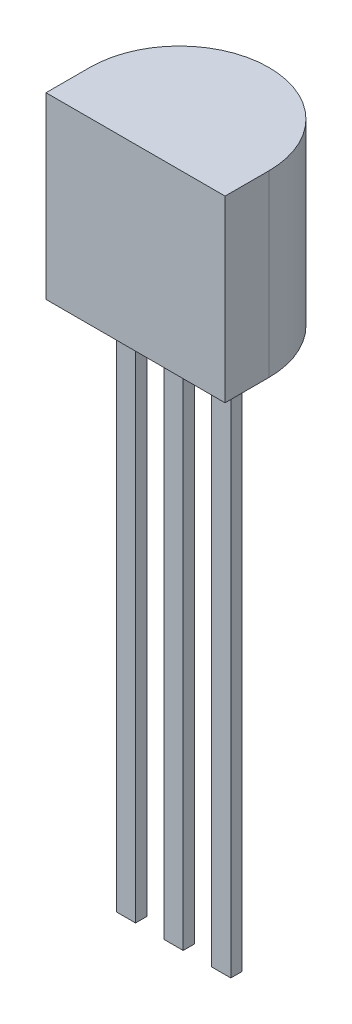
ISO-10303-21;
HEADER;
FILE_DESCRIPTION(('STEP AP214'),'2;1');
FILE_NAME('part.step','',(''),(''),'','','');
FILE_SCHEMA(('AUTOMOTIVE_DESIGN { 1 0 10303 214 1 1 1 1 }'));
ENDSEC;
DATA;
#1=APPLICATION_CONTEXT('core data for automotive mechanical design processes');
#2=APPLICATION_PROTOCOL_DEFINITION('international standard','automotive_design',2000,#1);
#3=PRODUCT_CONTEXT('',#1,'mechanical');
#4=PRODUCT('Part','Part','',(#3));
#5=PRODUCT_RELATED_PRODUCT_CATEGORY('part','',(#4));
#6=PRODUCT_DEFINITION_FORMATION('','',#4);
#7=PRODUCT_DEFINITION_CONTEXT('part definition',#1,'design');
#8=PRODUCT_DEFINITION('design','',#6,#7);
#9=PRODUCT_DEFINITION_SHAPE('','',#8);
#10=(LENGTH_UNIT() NAMED_UNIT(*) SI_UNIT(.MILLI.,.METRE.));
#11=(NAMED_UNIT(*) PLANE_ANGLE_UNIT() SI_UNIT($,.RADIAN.));
#12=(NAMED_UNIT(*) SI_UNIT($,.STERADIAN.) SOLID_ANGLE_UNIT());
#13=UNCERTAINTY_MEASURE_WITH_UNIT(LENGTH_MEASURE(1.E-05),#10,'distance_accuracy_value','');
#14=(GEOMETRIC_REPRESENTATION_CONTEXT(3) GLOBAL_UNCERTAINTY_ASSIGNED_CONTEXT((#13)) GLOBAL_UNIT_ASSIGNED_CONTEXT((#10,
#11,#12)) REPRESENTATION_CONTEXT('',''));
#15=CARTESIAN_POINT('',(0.,0.,0.));
#16=DIRECTION('',(0.,0.,1.));
#17=DIRECTION('',(1.,0.,0.));
#18=AXIS2_PLACEMENT_3D('',#15,#16,#17);
#19=CARTESIAN_POINT('',(0.,0.,-1.15));
#20=DIRECTION('',(0.,1.,0.));
#21=DIRECTION('',(0.,0.,1.));
#22=AXIS2_PLACEMENT_3D('',#19,#20,#21);
#23=PLANE('',#22);
#24=DIRECTION('',(-1.,0.,0.));
#25=VECTOR('',#24,1.);
#26=CARTESIAN_POINT('',(-0.999999999999999,0.,-1.));
#27=LINE('',#26,#25);
#28=CARTESIAN_POINT('',(-0.999999999999999,0.,-1.));
#29=VERTEX_POINT('',#28);
#30=CARTESIAN_POINT('',(-1.5,0.,-1.));
#31=VERTEX_POINT('',#30);
#32=EDGE_CURVE('E169',#29,#31,#27,.T.);
#33=ORIENTED_EDGE('',*,*,#32,.F.);
#34=DIRECTION('',(0.,0.,1.));
#35=VECTOR('',#34,1.);
#36=CARTESIAN_POINT('',(-0.999999999999999,0.,-1.));
#37=LINE('',#36,#35);
#38=CARTESIAN_POINT('',(-0.999999999999999,0.,-1.3));
#39=VERTEX_POINT('',#38);
#40=EDGE_CURVE('E182',#39,#29,#37,.T.);
#41=ORIENTED_EDGE('',*,*,#40,.F.);
#42=DIRECTION('',(1.,0.,0.));
#43=VECTOR('',#42,1.);
#44=CARTESIAN_POINT('',(-0.999999999999999,0.,-1.3));
#45=LINE('',#44,#43);
#46=CARTESIAN_POINT('',(-1.5,0.,-1.3));
#47=VERTEX_POINT('',#46);
#48=EDGE_CURVE('E191',#47,#39,#45,.T.);
#49=ORIENTED_EDGE('',*,*,#48,.F.);
#50=DIRECTION('',(0.,0.,-1.));
#51=VECTOR('',#50,1.);
#52=CARTESIAN_POINT('',(-1.5,0.,-1.));
#53=LINE('',#52,#51);
#54=EDGE_CURVE('E172',#31,#47,#53,.T.);
#55=ORIENTED_EDGE('',*,*,#54,.F.);
#56=EDGE_LOOP('',(#33,#41,#49,#55));
#57=FACE_BOUND('',#56,.T.);
#58=DIRECTION('',(0.,0.,1.));
#59=VECTOR('',#58,1.);
#60=CARTESIAN_POINT('',(-2.35,0.,0.));
#61=LINE('',#60,#59);
#62=CARTESIAN_POINT('',(-2.35,0.,-1.15));
#63=VERTEX_POINT('',#62);
#64=CARTESIAN_POINT('',(-2.35,0.,0.));
#65=VERTEX_POINT('',#64);
#66=EDGE_CURVE('E240',#63,#65,#61,.T.);
#67=ORIENTED_EDGE('',*,*,#66,.F.);
#68=CARTESIAN_POINT('',(0.,0.,-1.15));
#69=DIRECTION('',(0.,1.,0.));
#70=DIRECTION('',(0.,0.,1.));
#71=AXIS2_PLACEMENT_3D('',#68,#69,#70);
#72=CIRCLE('',#71,2.35);
#73=CARTESIAN_POINT('',(2.35,0.,-1.15));
#74=VERTEX_POINT('',#73);
#75=EDGE_CURVE('E245',#74,#63,#72,.T.);
#76=ORIENTED_EDGE('',*,*,#75,.F.);
#77=DIRECTION('',(0.,0.,-1.));
#78=VECTOR('',#77,1.);
#79=CARTESIAN_POINT('',(2.35,0.,0.));
#80=LINE('',#79,#78);
#81=CARTESIAN_POINT('',(2.35,0.,0.));
#82=VERTEX_POINT('',#81);
#83=EDGE_CURVE('E256',#82,#74,#80,.T.);
#84=ORIENTED_EDGE('',*,*,#83,.F.);
#85=DIRECTION('',(1.,0.,0.));
#86=VECTOR('',#85,1.);
#87=CARTESIAN_POINT('',(-2.35,0.,0.));
#88=LINE('',#87,#86);
#89=EDGE_CURVE('E254',#65,#82,#88,.T.);
#90=ORIENTED_EDGE('',*,*,#89,.F.);
#91=EDGE_LOOP('',(#67,#76,#84,#90));
#92=FACE_BOUND('',#91,.T.);
#93=DIRECTION('',(0.,0.,-1.));
#94=VECTOR('',#93,1.);
#95=CARTESIAN_POINT('',(-0.25,0.,-1.));
#96=LINE('',#95,#94);
#97=CARTESIAN_POINT('',(-0.25,0.,-1.));
#98=VERTEX_POINT('',#97);
#99=CARTESIAN_POINT('',(-0.25,0.,-1.3));
#100=VERTEX_POINT('',#99);
#101=EDGE_CURVE('E207',#98,#100,#96,.T.);
#102=ORIENTED_EDGE('',*,*,#101,.F.);
#103=DIRECTION('',(-1.,0.,0.));
#104=VECTOR('',#103,1.);
#105=CARTESIAN_POINT('',(-0.25,0.,-1.));
#106=LINE('',#105,#104);
#107=CARTESIAN_POINT('',(0.25,0.,-1.));
#108=VERTEX_POINT('',#107);
#109=EDGE_CURVE('E212',#108,#98,#106,.T.);
#110=ORIENTED_EDGE('',*,*,#109,.F.);
#111=DIRECTION('',(0.,0.,1.));
#112=VECTOR('',#111,1.);
#113=CARTESIAN_POINT('',(0.25,0.,-1.));
#114=LINE('',#113,#112);
#115=CARTESIAN_POINT('',(0.250000000000001,0.,-1.3));
#116=VERTEX_POINT('',#115);
#117=EDGE_CURVE('E224',#116,#108,#114,.T.);
#118=ORIENTED_EDGE('',*,*,#117,.F.);
#119=DIRECTION('',(1.,0.,0.));
#120=VECTOR('',#119,1.);
#121=CARTESIAN_POINT('',(-0.25,0.,-1.3));
#122=LINE('',#121,#120);
#123=EDGE_CURVE('E221',#100,#116,#122,.T.);
#124=ORIENTED_EDGE('',*,*,#123,.F.);
#125=EDGE_LOOP('',(#102,#110,#118,#124));
#126=FACE_BOUND('',#125,.T.);
#127=DIRECTION('',(0.,0.,-1.));
#128=VECTOR('',#127,1.);
#129=CARTESIAN_POINT('',(1.,0.,-1.));
#130=LINE('',#129,#128);
#131=CARTESIAN_POINT('',(1.,0.,-1.));
#132=VERTEX_POINT('',#131);
#133=CARTESIAN_POINT('',(1.,0.,-1.3));
#134=VERTEX_POINT('',#133);
#135=EDGE_CURVE('E168',#132,#134,#130,.T.);
#136=ORIENTED_EDGE('',*,*,#135,.F.);
#137=DIRECTION('',(-1.,0.,0.));
#138=VECTOR('',#137,1.);
#139=CARTESIAN_POINT('',(1.,0.,-1.));
#140=LINE('',#139,#138);
#141=CARTESIAN_POINT('',(1.5,0.,-1.));
#142=VERTEX_POINT('',#141);
#143=EDGE_CURVE('E165',#142,#132,#140,.T.);
#144=ORIENTED_EDGE('',*,*,#143,.F.);
#145=DIRECTION('',(0.,0.,1.));
#146=VECTOR('',#145,1.);
#147=CARTESIAN_POINT('',(1.5,0.,-1.));
#148=LINE('',#147,#146);
#149=CARTESIAN_POINT('',(1.5,0.,-1.3));
#150=VERTEX_POINT('',#149);
#151=EDGE_CURVE('E55',#150,#142,#148,.T.);
#152=ORIENTED_EDGE('',*,*,#151,.F.);
#153=DIRECTION('',(1.,0.,0.));
#154=VECTOR('',#153,1.);
#155=CARTESIAN_POINT('',(1.,0.,-1.3));
#156=LINE('',#155,#154);
#157=EDGE_CURVE('E50',#134,#150,#156,.T.);
#158=ORIENTED_EDGE('',*,*,#157,.F.);
#159=EDGE_LOOP('',(#136,#144,#152,#158));
#160=FACE_BOUND('',#159,.T.);
#161=ADVANCED_FACE('F35',(#57,#92,#126,#160),#23,.F.);
#162=CARTESIAN_POINT('',(-2.35,4.7,0.));
#163=DIRECTION('',(1.,0.,0.));
#164=DIRECTION('',(0.,0.,-1.));
#165=AXIS2_PLACEMENT_3D('',#162,#163,#164);
#166=PLANE('',#165);
#167=ORIENTED_EDGE('',*,*,#66,.T.);
#168=DIRECTION('',(0.,-1.,0.));
#169=VECTOR('',#168,1.);
#170=CARTESIAN_POINT('',(-2.35,4.7,0.));
#171=LINE('',#170,#169);
#172=CARTESIAN_POINT('',(-2.35,4.7,0.));
#173=VERTEX_POINT('',#172);
#174=EDGE_CURVE('E11',#173,#65,#171,.T.);
#175=ORIENTED_EDGE('',*,*,#174,.F.);
#176=DIRECTION('',(0.,0.,1.));
#177=VECTOR('',#176,1.);
#178=CARTESIAN_POINT('',(-2.35,4.7,0.));
#179=LINE('',#178,#177);
#180=CARTESIAN_POINT('',(-2.35,4.7,-1.15));
#181=VERTEX_POINT('',#180);
#182=EDGE_CURVE('E241',#181,#173,#179,.T.);
#183=ORIENTED_EDGE('',*,*,#182,.F.);
#184=DIRECTION('',(0.,-1.,0.));
#185=VECTOR('',#184,1.);
#186=CARTESIAN_POINT('',(-2.35,4.7,-1.15));
#187=LINE('',#186,#185);
#188=EDGE_CURVE('E251',#181,#63,#187,.T.);
#189=ORIENTED_EDGE('',*,*,#188,.T.);
#190=EDGE_LOOP('',(#167,#175,#183,#189));
#191=FACE_BOUND('',#190,.T.);
#192=ADVANCED_FACE('F37',(#191),#166,.F.);
#193=CARTESIAN_POINT('',(-2.35,4.7,0.));
#194=DIRECTION('',(0.,0.,-1.));
#195=DIRECTION('',(-1.,0.,0.));
#196=AXIS2_PLACEMENT_3D('',#193,#194,#195);
#197=PLANE('',#196);
#198=ORIENTED_EDGE('',*,*,#89,.T.);
#199=DIRECTION('',(0.,-1.,0.));
#200=VECTOR('',#199,1.);
#201=CARTESIAN_POINT('',(2.35,4.7,0.));
#202=LINE('',#201,#200);
#203=CARTESIAN_POINT('',(2.35,4.7,0.));
#204=VERTEX_POINT('',#203);
#205=EDGE_CURVE('E43',#204,#82,#202,.T.);
#206=ORIENTED_EDGE('',*,*,#205,.F.);
#207=DIRECTION('',(1.,0.,0.));
#208=VECTOR('',#207,1.);
#209=CARTESIAN_POINT('',(-2.35,4.7,0.));
#210=LINE('',#209,#208);
#211=EDGE_CURVE('E244',#173,#204,#210,.T.);
#212=ORIENTED_EDGE('',*,*,#211,.F.);
#213=ORIENTED_EDGE('',*,*,#174,.T.);
#214=EDGE_LOOP('',(#198,#206,#212,#213));
#215=FACE_BOUND('',#214,.T.);
#216=ADVANCED_FACE('F284',(#215),#197,.F.);
#217=CARTESIAN_POINT('',(2.35,4.7,0.));
#218=DIRECTION('',(-1.,0.,0.));
#219=DIRECTION('',(0.,0.,1.));
#220=AXIS2_PLACEMENT_3D('',#217,#218,#219);
#221=PLANE('',#220);
#222=ORIENTED_EDGE('',*,*,#83,.T.);
#223=DIRECTION('',(0.,-1.,0.));
#224=VECTOR('',#223,1.);
#225=CARTESIAN_POINT('',(2.35,4.7,-1.15));
#226=LINE('',#225,#224);
#227=CARTESIAN_POINT('',(2.35,4.7,-1.15));
#228=VERTEX_POINT('',#227);
#229=EDGE_CURVE('E261',#228,#74,#226,.T.);
#230=ORIENTED_EDGE('',*,*,#229,.F.);
#231=DIRECTION('',(0.,0.,-1.));
#232=VECTOR('',#231,1.);
#233=CARTESIAN_POINT('',(2.35,4.7,0.));
#234=LINE('',#233,#232);
#235=EDGE_CURVE('E247',#204,#228,#234,.T.);
#236=ORIENTED_EDGE('',*,*,#235,.F.);
#237=ORIENTED_EDGE('',*,*,#205,.T.);
#238=EDGE_LOOP('',(#222,#230,#236,#237));
#239=FACE_BOUND('',#238,.T.);
#240=ADVANCED_FACE('F268',(#239),#221,.F.);
#241=CARTESIAN_POINT('',(0.,4.7,-1.15));
#242=DIRECTION('',(0.,-1.,0.));
#243=DIRECTION('',(0.,0.,-1.));
#244=AXIS2_PLACEMENT_3D('',#241,#242,#243);
#245=CYLINDRICAL_SURFACE('',#244,2.35);
#246=ORIENTED_EDGE('',*,*,#75,.T.);
#247=ORIENTED_EDGE('',*,*,#188,.F.);
#248=CARTESIAN_POINT('',(0.,4.7,-1.15));
#249=DIRECTION('',(0.,1.,0.));
#250=DIRECTION('',(0.,0.,1.));
#251=AXIS2_PLACEMENT_3D('',#248,#249,#250);
#252=CIRCLE('',#251,2.35);
#253=EDGE_CURVE('E249',#228,#181,#252,.T.);
#254=ORIENTED_EDGE('',*,*,#253,.F.);
#255=ORIENTED_EDGE('',*,*,#229,.T.);
#256=EDGE_LOOP('',(#246,#247,#254,#255));
#257=FACE_BOUND('',#256,.T.);
#258=ADVANCED_FACE('F277',(#257),#245,.T.);
#259=CARTESIAN_POINT('',(0.,4.7,-1.15));
#260=DIRECTION('',(0.,1.,0.));
#261=DIRECTION('',(0.,0.,1.));
#262=AXIS2_PLACEMENT_3D('',#259,#260,#261);
#263=PLANE('',#262);
#264=ORIENTED_EDGE('',*,*,#182,.T.);
#265=ORIENTED_EDGE('',*,*,#211,.T.);
#266=ORIENTED_EDGE('',*,*,#235,.T.);
#267=ORIENTED_EDGE('',*,*,#253,.T.);
#268=EDGE_LOOP('',(#264,#265,#266,#267));
#269=FACE_BOUND('',#268,.T.);
#270=ADVANCED_FACE('F283',(#269),#263,.T.);
#271=CARTESIAN_POINT('',(-0.25,-14.,-1.));
#272=DIRECTION('',(1.,0.,0.));
#273=DIRECTION('',(0.,0.,-1.));
#274=AXIS2_PLACEMENT_3D('',#271,#272,#273);
#275=PLANE('',#274);
#276=ORIENTED_EDGE('',*,*,#101,.T.);
#277=DIRECTION('',(0.,1.,0.));
#278=VECTOR('',#277,1.);
#279=CARTESIAN_POINT('',(-0.25,-14.,-1.3));
#280=LINE('',#279,#278);
#281=CARTESIAN_POINT('',(-0.25,-14.,-1.3));
#282=VERTEX_POINT('',#281);
#283=EDGE_CURVE('E237',#282,#100,#280,.T.);
#284=ORIENTED_EDGE('',*,*,#283,.F.);
#285=DIRECTION('',(0.,0.,-1.));
#286=VECTOR('',#285,1.);
#287=CARTESIAN_POINT('',(-0.25,-14.,-1.));
#288=LINE('',#287,#286);
#289=CARTESIAN_POINT('',(-0.25,-14.,-1.));
#290=VERTEX_POINT('',#289);
#291=EDGE_CURVE('E208',#290,#282,#288,.T.);
#292=ORIENTED_EDGE('',*,*,#291,.F.);
#293=DIRECTION('',(0.,1.,0.));
#294=VECTOR('',#293,1.);
#295=CARTESIAN_POINT('',(-0.25,-14.,-1.));
#296=LINE('',#295,#294);
#297=EDGE_CURVE('E218',#290,#98,#296,.T.);
#298=ORIENTED_EDGE('',*,*,#297,.T.);
#299=EDGE_LOOP('',(#276,#284,#292,#298));
#300=FACE_BOUND('',#299,.T.);
#301=ADVANCED_FACE('F305',(#300),#275,.F.);
#302=CARTESIAN_POINT('',(-0.25,-14.,-1.3));
#303=DIRECTION('',(0.,0.,1.));
#304=DIRECTION('',(1.,0.,0.));
#305=AXIS2_PLACEMENT_3D('',#302,#303,#304);
#306=PLANE('',#305);
#307=ORIENTED_EDGE('',*,*,#123,.T.);
#308=DIRECTION('',(0.,1.,0.));
#309=VECTOR('',#308,1.);
#310=CARTESIAN_POINT('',(0.250000000000001,-14.,-1.3));
#311=LINE('',#310,#309);
#312=CARTESIAN_POINT('',(0.250000000000001,-14.,-1.3));
#313=VERTEX_POINT('',#312);
#314=EDGE_CURVE('E234',#313,#116,#311,.T.);
#315=ORIENTED_EDGE('',*,*,#314,.F.);
#316=DIRECTION('',(1.,0.,0.));
#317=VECTOR('',#316,1.);
#318=CARTESIAN_POINT('',(-0.25,-14.,-1.3));
#319=LINE('',#318,#317);
#320=EDGE_CURVE('E211',#282,#313,#319,.T.);
#321=ORIENTED_EDGE('',*,*,#320,.F.);
#322=ORIENTED_EDGE('',*,*,#283,.T.);
#323=EDGE_LOOP('',(#307,#315,#321,#322));
#324=FACE_BOUND('',#323,.T.);
#325=ADVANCED_FACE('F309',(#324),#306,.F.);
#326=CARTESIAN_POINT('',(0.25,-14.,-1.));
#327=DIRECTION('',(-1.,0.,0.));
#328=DIRECTION('',(0.,0.,1.));
#329=AXIS2_PLACEMENT_3D('',#326,#327,#328);
#330=PLANE('',#329);
#331=ORIENTED_EDGE('',*,*,#117,.T.);
#332=DIRECTION('',(0.,1.,0.));
#333=VECTOR('',#332,1.);
#334=CARTESIAN_POINT('',(0.25,-14.,-1.));
#335=LINE('',#334,#333);
#336=CARTESIAN_POINT('',(0.25,-14.,-1.));
#337=VERTEX_POINT('',#336);
#338=EDGE_CURVE('E231',#337,#108,#335,.T.);
#339=ORIENTED_EDGE('',*,*,#338,.F.);
#340=DIRECTION('',(0.,0.,1.));
#341=VECTOR('',#340,1.);
#342=CARTESIAN_POINT('',(0.25,-14.,-1.));
#343=LINE('',#342,#341);
#344=EDGE_CURVE('E214',#313,#337,#343,.T.);
#345=ORIENTED_EDGE('',*,*,#344,.F.);
#346=ORIENTED_EDGE('',*,*,#314,.T.);
#347=EDGE_LOOP('',(#331,#339,#345,#346));
#348=FACE_BOUND('',#347,.T.);
#349=ADVANCED_FACE('F313',(#348),#330,.F.);
#350=CARTESIAN_POINT('',(-0.25,-14.,-1.));
#351=DIRECTION('',(0.,0.,-1.));
#352=DIRECTION('',(-1.,0.,0.));
#353=AXIS2_PLACEMENT_3D('',#350,#351,#352);
#354=PLANE('',#353);
#355=ORIENTED_EDGE('',*,*,#109,.T.);
#356=ORIENTED_EDGE('',*,*,#297,.F.);
#357=DIRECTION('',(-1.,0.,0.));
#358=VECTOR('',#357,1.);
#359=CARTESIAN_POINT('',(-0.25,-14.,-1.));
#360=LINE('',#359,#358);
#361=EDGE_CURVE('E216',#337,#290,#360,.T.);
#362=ORIENTED_EDGE('',*,*,#361,.F.);
#363=ORIENTED_EDGE('',*,*,#338,.T.);
#364=EDGE_LOOP('',(#355,#356,#362,#363));
#365=FACE_BOUND('',#364,.T.);
#366=ADVANCED_FACE('F319',(#365),#354,.F.);
#367=CARTESIAN_POINT('',(0.,-14.,0.));
#368=DIRECTION('',(0.,-1.,0.));
#369=DIRECTION('',(0.,0.,-1.));
#370=AXIS2_PLACEMENT_3D('',#367,#368,#369);
#371=PLANE('',#370);
#372=ORIENTED_EDGE('',*,*,#291,.T.);
#373=ORIENTED_EDGE('',*,*,#320,.T.);
#374=ORIENTED_EDGE('',*,*,#344,.T.);
#375=ORIENTED_EDGE('',*,*,#361,.T.);
#376=EDGE_LOOP('',(#372,#373,#374,#375));
#377=FACE_BOUND('',#376,.T.);
#378=ADVANCED_FACE('F323',(#377),#371,.T.);
#379=CARTESIAN_POINT('',(-0.999999999999999,-14.,-1.));
#380=DIRECTION('',(0.,0.,-1.));
#381=DIRECTION('',(-1.,0.,0.));
#382=AXIS2_PLACEMENT_3D('',#379,#380,#381);
#383=PLANE('',#382);
#384=ORIENTED_EDGE('',*,*,#32,.T.);
#385=DIRECTION('',(0.,1.,0.));
#386=VECTOR('',#385,1.);
#387=CARTESIAN_POINT('',(-1.5,-14.,-1.));
#388=LINE('',#387,#386);
#389=CARTESIAN_POINT('',(-1.5,-14.,-1.));
#390=VERTEX_POINT('',#389);
#391=EDGE_CURVE('E204',#390,#31,#388,.T.);
#392=ORIENTED_EDGE('',*,*,#391,.F.);
#393=DIRECTION('',(-1.,0.,0.));
#394=VECTOR('',#393,1.);
#395=CARTESIAN_POINT('',(-0.999999999999999,-14.,-1.));
#396=LINE('',#395,#394);
#397=CARTESIAN_POINT('',(-0.999999999999999,-14.,-1.));
#398=VERTEX_POINT('',#397);
#399=EDGE_CURVE('E178',#398,#390,#396,.T.);
#400=ORIENTED_EDGE('',*,*,#399,.F.);
#401=DIRECTION('',(0.,1.,0.));
#402=VECTOR('',#401,1.);
#403=CARTESIAN_POINT('',(-0.999999999999999,-14.,-1.));
#404=LINE('',#403,#402);
#405=EDGE_CURVE('E187',#398,#29,#404,.T.);
#406=ORIENTED_EDGE('',*,*,#405,.T.);
#407=EDGE_LOOP('',(#384,#392,#400,#406));
#408=FACE_BOUND('',#407,.T.);
#409=ADVANCED_FACE('F327',(#408),#383,.F.);
#410=CARTESIAN_POINT('',(-1.5,-14.,-1.));
#411=DIRECTION('',(1.,0.,0.));
#412=DIRECTION('',(0.,0.,-1.));
#413=AXIS2_PLACEMENT_3D('',#410,#411,#412);
#414=PLANE('',#413);
#415=ORIENTED_EDGE('',*,*,#54,.T.);
#416=DIRECTION('',(0.,1.,0.));
#417=VECTOR('',#416,1.);
#418=CARTESIAN_POINT('',(-1.5,-14.,-1.3));
#419=LINE('',#418,#417);
#420=CARTESIAN_POINT('',(-1.5,-14.,-1.3));
#421=VERTEX_POINT('',#420);
#422=EDGE_CURVE('E201',#421,#47,#419,.T.);
#423=ORIENTED_EDGE('',*,*,#422,.F.);
#424=DIRECTION('',(0.,0.,-1.));
#425=VECTOR('',#424,1.);
#426=CARTESIAN_POINT('',(-1.5,-14.,-1.));
#427=LINE('',#426,#425);
#428=EDGE_CURVE('E181',#390,#421,#427,.T.);
#429=ORIENTED_EDGE('',*,*,#428,.F.);
#430=ORIENTED_EDGE('',*,*,#391,.T.);
#431=EDGE_LOOP('',(#415,#423,#429,#430));
#432=FACE_BOUND('',#431,.T.);
#433=ADVANCED_FACE('F331',(#432),#414,.F.);
#434=CARTESIAN_POINT('',(-0.999999999999999,-14.,-1.3));
#435=DIRECTION('',(0.,0.,1.));
#436=DIRECTION('',(1.,0.,0.));
#437=AXIS2_PLACEMENT_3D('',#434,#435,#436);
#438=PLANE('',#437);
#439=ORIENTED_EDGE('',*,*,#48,.T.);
#440=DIRECTION('',(0.,1.,0.));
#441=VECTOR('',#440,1.);
#442=CARTESIAN_POINT('',(-0.999999999999999,-14.,-1.3));
#443=LINE('',#442,#441);
#444=CARTESIAN_POINT('',(-0.999999999999999,-14.,-1.3));
#445=VERTEX_POINT('',#444);
#446=EDGE_CURVE('E198',#445,#39,#443,.T.);
#447=ORIENTED_EDGE('',*,*,#446,.F.);
#448=DIRECTION('',(1.,0.,0.));
#449=VECTOR('',#448,1.);
#450=CARTESIAN_POINT('',(-0.999999999999999,-14.,-1.3));
#451=LINE('',#450,#449);
#452=EDGE_CURVE('E184',#421,#445,#451,.T.);
#453=ORIENTED_EDGE('',*,*,#452,.F.);
#454=ORIENTED_EDGE('',*,*,#422,.T.);
#455=EDGE_LOOP('',(#439,#447,#453,#454));
#456=FACE_BOUND('',#455,.T.);
#457=ADVANCED_FACE('F335',(#456),#438,.F.);
#458=CARTESIAN_POINT('',(-0.999999999999999,-14.,-1.));
#459=DIRECTION('',(-1.,0.,0.));
#460=DIRECTION('',(0.,0.,1.));
#461=AXIS2_PLACEMENT_3D('',#458,#459,#460);
#462=PLANE('',#461);
#463=ORIENTED_EDGE('',*,*,#40,.T.);
#464=ORIENTED_EDGE('',*,*,#405,.F.);
#465=DIRECTION('',(0.,0.,1.));
#466=VECTOR('',#465,1.);
#467=CARTESIAN_POINT('',(-0.999999999999999,-14.,-1.));
#468=LINE('',#467,#466);
#469=EDGE_CURVE('E186',#445,#398,#468,.T.);
#470=ORIENTED_EDGE('',*,*,#469,.F.);
#471=ORIENTED_EDGE('',*,*,#446,.T.);
#472=EDGE_LOOP('',(#463,#464,#470,#471));
#473=FACE_BOUND('',#472,.T.);
#474=ADVANCED_FACE('F339',(#473),#462,.F.);
#475=CARTESIAN_POINT('',(0.,-14.,0.));
#476=DIRECTION('',(0.,-1.,0.));
#477=DIRECTION('',(0.,0.,-1.));
#478=AXIS2_PLACEMENT_3D('',#475,#476,#477);
#479=PLANE('',#478);
#480=ORIENTED_EDGE('',*,*,#399,.T.);
#481=ORIENTED_EDGE('',*,*,#428,.T.);
#482=ORIENTED_EDGE('',*,*,#452,.T.);
#483=ORIENTED_EDGE('',*,*,#469,.T.);
#484=EDGE_LOOP('',(#480,#481,#482,#483));
#485=FACE_BOUND('',#484,.T.);
#486=ADVANCED_FACE('F343',(#485),#479,.T.);
#487=CARTESIAN_POINT('',(1.,-14.,-1.));
#488=DIRECTION('',(1.,0.,0.));
#489=DIRECTION('',(0.,0.,-1.));
#490=AXIS2_PLACEMENT_3D('',#487,#488,#489);
#491=PLANE('',#490);
#492=ORIENTED_EDGE('',*,*,#135,.T.);
#493=DIRECTION('',(0.,1.,0.));
#494=VECTOR('',#493,1.);
#495=CARTESIAN_POINT('',(1.,-14.,-1.3));
#496=LINE('',#495,#494);
#497=CARTESIAN_POINT('',(1.,-14.,-1.3));
#498=VERTEX_POINT('',#497);
#499=EDGE_CURVE('E149',#498,#134,#496,.T.);
#500=ORIENTED_EDGE('',*,*,#499,.F.);
#501=DIRECTION('',(0.,0.,-1.));
#502=VECTOR('',#501,1.);
#503=CARTESIAN_POINT('',(1.,-14.,-1.));
#504=LINE('',#503,#502);
#505=CARTESIAN_POINT('',(1.,-14.,-1.));
#506=VERTEX_POINT('',#505);
#507=EDGE_CURVE('E156',#506,#498,#504,.T.);
#508=ORIENTED_EDGE('',*,*,#507,.F.);
#509=DIRECTION('',(0.,1.,0.));
#510=VECTOR('',#509,1.);
#511=CARTESIAN_POINT('',(1.,-14.,-1.));
#512=LINE('',#511,#510);
#513=EDGE_CURVE('E478',#506,#132,#512,.T.);
#514=ORIENTED_EDGE('',*,*,#513,.T.);
#515=EDGE_LOOP('',(#492,#500,#508,#514));
#516=FACE_BOUND('',#515,.T.);
#517=ADVANCED_FACE('F167',(#516),#491,.F.);
#518=CARTESIAN_POINT('',(1.,-14.,-1.3));
#519=DIRECTION('',(0.,0.,1.));
#520=DIRECTION('',(1.,0.,0.));
#521=AXIS2_PLACEMENT_3D('',#518,#519,#520);
#522=PLANE('',#521);
#523=ORIENTED_EDGE('',*,*,#157,.T.);
#524=DIRECTION('',(0.,1.,0.));
#525=VECTOR('',#524,1.);
#526=CARTESIAN_POINT('',(1.5,-14.,-1.3));
#527=LINE('',#526,#525);
#528=CARTESIAN_POINT('',(1.5,-14.,-1.3));
#529=VERTEX_POINT('',#528);
#530=EDGE_CURVE('E152',#529,#150,#527,.T.);
#531=ORIENTED_EDGE('',*,*,#530,.F.);
#532=DIRECTION('',(1.,0.,0.));
#533=VECTOR('',#532,1.);
#534=CARTESIAN_POINT('',(1.,-14.,-1.3));
#535=LINE('',#534,#533);
#536=EDGE_CURVE('E145',#498,#529,#535,.T.);
#537=ORIENTED_EDGE('',*,*,#536,.F.);
#538=ORIENTED_EDGE('',*,*,#499,.T.);
#539=EDGE_LOOP('',(#523,#531,#537,#538));
#540=FACE_BOUND('',#539,.T.);
#541=ADVANCED_FACE('F147',(#540),#522,.F.);
#542=CARTESIAN_POINT('',(1.5,-14.,-1.));
#543=DIRECTION('',(-1.,0.,0.));
#544=DIRECTION('',(0.,0.,1.));
#545=AXIS2_PLACEMENT_3D('',#542,#543,#544);
#546=PLANE('',#545);
#547=ORIENTED_EDGE('',*,*,#151,.T.);
#548=DIRECTION('',(0.,1.,0.));
#549=VECTOR('',#548,1.);
#550=CARTESIAN_POINT('',(1.5,-14.,-1.));
#551=LINE('',#550,#549);
#552=CARTESIAN_POINT('',(1.5,-14.,-1.));
#553=VERTEX_POINT('',#552);
#554=EDGE_CURVE('E174',#553,#142,#551,.T.);
#555=ORIENTED_EDGE('',*,*,#554,.F.);
#556=DIRECTION('',(0.,0.,1.));
#557=VECTOR('',#556,1.);
#558=CARTESIAN_POINT('',(1.5,-14.,-1.));
#559=LINE('',#558,#557);
#560=EDGE_CURVE('E155',#529,#553,#559,.T.);
#561=ORIENTED_EDGE('',*,*,#560,.F.);
#562=ORIENTED_EDGE('',*,*,#530,.T.);
#563=EDGE_LOOP('',(#547,#555,#561,#562));
#564=FACE_BOUND('',#563,.T.);
#565=ADVANCED_FACE('F352',(#564),#546,.F.);
#566=CARTESIAN_POINT('',(1.,-14.,-1.));
#567=DIRECTION('',(0.,0.,-1.));
#568=DIRECTION('',(-1.,0.,0.));
#569=AXIS2_PLACEMENT_3D('',#566,#567,#568);
#570=PLANE('',#569);
#571=ORIENTED_EDGE('',*,*,#143,.T.);
#572=ORIENTED_EDGE('',*,*,#513,.F.);
#573=DIRECTION('',(-1.,0.,0.));
#574=VECTOR('',#573,1.);
#575=CARTESIAN_POINT('',(1.,-14.,-1.));
#576=LINE('',#575,#574);
#577=EDGE_CURVE('E161',#553,#506,#576,.T.);
#578=ORIENTED_EDGE('',*,*,#577,.F.);
#579=ORIENTED_EDGE('',*,*,#554,.T.);
#580=EDGE_LOOP('',(#571,#572,#578,#579));
#581=FACE_BOUND('',#580,.T.);
#582=ADVANCED_FACE('F355',(#581),#570,.F.);
#583=CARTESIAN_POINT('',(0.,-14.,0.));
#584=DIRECTION('',(0.,-1.,0.));
#585=DIRECTION('',(0.,0.,-1.));
#586=AXIS2_PLACEMENT_3D('',#583,#584,#585);
#587=PLANE('',#586);
#588=ORIENTED_EDGE('',*,*,#507,.T.);
#589=ORIENTED_EDGE('',*,*,#536,.T.);
#590=ORIENTED_EDGE('',*,*,#560,.T.);
#591=ORIENTED_EDGE('',*,*,#577,.T.);
#592=EDGE_LOOP('',(#588,#589,#590,#591));
#593=FACE_BOUND('',#592,.T.);
#594=ADVANCED_FACE('F159',(#593),#587,.T.);
#595=CLOSED_SHELL('',(#161,#192,#216,#240,#258,#270,#301,#325,#349,#366,#378,#409,#433,#457,
#474,#486,#517,#541,#565,#582,#594));
#596=MANIFOLD_SOLID_BREP('B2',#595);
#597=ADVANCED_BREP_SHAPE_REPRESENTATION('',(#18,#596),#14);
#598=SHAPE_DEFINITION_REPRESENTATION(#9,#597);
ENDSEC;
END-ISO-10303-21;
